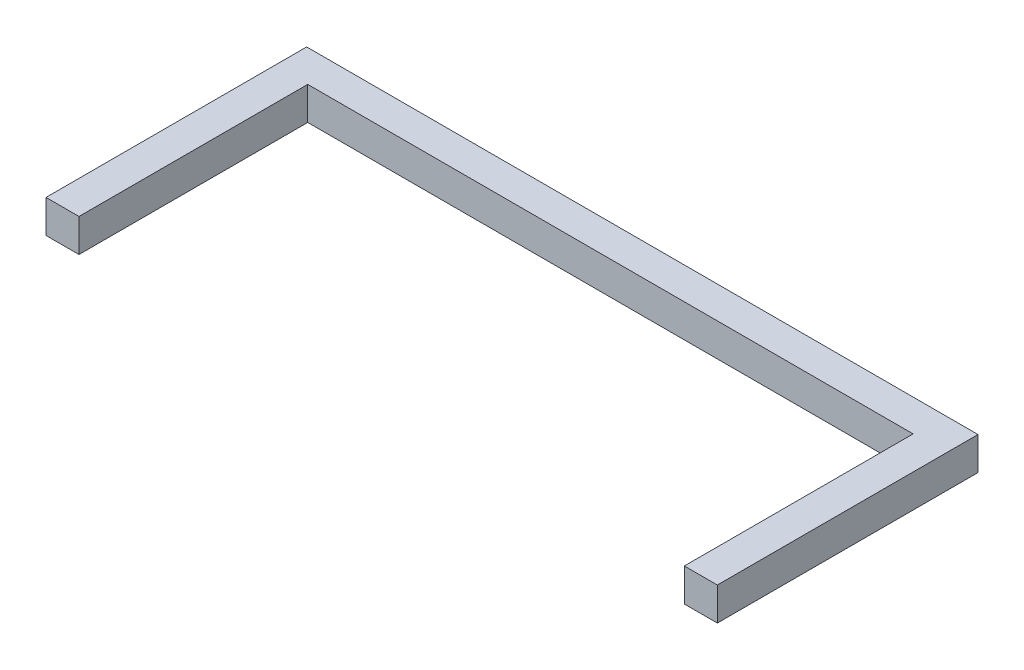
ISO-10303-21;
HEADER;
FILE_DESCRIPTION(('STEP AP214'),'2;1');
FILE_NAME('part.step','',(''),(''),'','','');
FILE_SCHEMA(('AUTOMOTIVE_DESIGN { 1 0 10303 214 1 1 1 1 }'));
ENDSEC;
DATA;
#1=APPLICATION_CONTEXT('core data for automotive mechanical design processes');
#2=APPLICATION_PROTOCOL_DEFINITION('international standard','automotive_design',2000,#1);
#3=PRODUCT_CONTEXT('',#1,'mechanical');
#4=PRODUCT('Part','Part','',(#3));
#5=PRODUCT_RELATED_PRODUCT_CATEGORY('part','',(#4));
#6=PRODUCT_DEFINITION_FORMATION('','',#4);
#7=PRODUCT_DEFINITION_CONTEXT('part definition',#1,'design');
#8=PRODUCT_DEFINITION('design','',#6,#7);
#9=PRODUCT_DEFINITION_SHAPE('','',#8);
#10=(LENGTH_UNIT() NAMED_UNIT(*) SI_UNIT(.MILLI.,.METRE.));
#11=(NAMED_UNIT(*) PLANE_ANGLE_UNIT() SI_UNIT($,.RADIAN.));
#12=(NAMED_UNIT(*) SI_UNIT($,.STERADIAN.) SOLID_ANGLE_UNIT());
#13=UNCERTAINTY_MEASURE_WITH_UNIT(LENGTH_MEASURE(1.E-05),#10,'distance_accuracy_value','');
#14=(GEOMETRIC_REPRESENTATION_CONTEXT(3) GLOBAL_UNCERTAINTY_ASSIGNED_CONTEXT((#13)) GLOBAL_UNIT_ASSIGNED_CONTEXT((#10,
#11,#12)) REPRESENTATION_CONTEXT('',''));
#15=CARTESIAN_POINT('',(0.,0.,0.));
#16=DIRECTION('',(0.,0.,1.));
#17=DIRECTION('',(1.,0.,0.));
#18=AXIS2_PLACEMENT_3D('',#15,#16,#17);
#19=CARTESIAN_POINT('',(3.1,3.1,0.));
#20=DIRECTION('',(0.,0.,-1.));
#21=DIRECTION('',(-1.,0.,0.));
#22=AXIS2_PLACEMENT_3D('',#19,#20,#21);
#23=PLANE('',#22);
#24=DIRECTION('',(1.,0.,0.));
#25=VECTOR('',#24,1.);
#26=CARTESIAN_POINT('',(3.1,0.,0.));
#27=LINE('',#26,#25);
#28=CARTESIAN_POINT('',(0.,0.,0.));
#29=VERTEX_POINT('',#28);
#30=CARTESIAN_POINT('',(3.1,0.,0.));
#31=VERTEX_POINT('',#30);
#32=EDGE_CURVE('E144',#29,#31,#27,.T.);
#33=ORIENTED_EDGE('',*,*,#32,.T.);
#34=DIRECTION('',(0.,-1.,0.));
#35=VECTOR('',#34,1.);
#36=CARTESIAN_POINT('',(3.1,3.1,0.));
#37=LINE('',#36,#35);
#38=CARTESIAN_POINT('',(3.1,3.1,0.));
#39=VERTEX_POINT('',#38);
#40=EDGE_CURVE('E11',#39,#31,#37,.T.);
#41=ORIENTED_EDGE('',*,*,#40,.F.);
#42=DIRECTION('',(1.,0.,0.));
#43=VECTOR('',#42,1.);
#44=CARTESIAN_POINT('',(3.1,3.1,0.));
#45=LINE('',#44,#43);
#46=CARTESIAN_POINT('',(0.,3.1,0.));
#47=VERTEX_POINT('',#46);
#48=EDGE_CURVE('E166',#47,#39,#45,.T.);
#49=ORIENTED_EDGE('',*,*,#48,.F.);
#50=DIRECTION('',(0.,-1.,0.));
#51=VECTOR('',#50,1.);
#52=CARTESIAN_POINT('',(0.,3.1,0.));
#53=LINE('',#52,#51);
#54=EDGE_CURVE('E140',#47,#29,#53,.T.);
#55=ORIENTED_EDGE('',*,*,#54,.T.);
#56=EDGE_LOOP('',(#33,#41,#49,#55));
#57=FACE_BOUND('',#56,.T.);
#58=ADVANCED_FACE('F43',(#57),#23,.F.);
#59=CARTESIAN_POINT('',(3.1,3.1,-21.5));
#60=DIRECTION('',(-1.,0.,0.));
#61=DIRECTION('',(0.,0.,1.));
#62=AXIS2_PLACEMENT_3D('',#59,#60,#61);
#63=PLANE('',#62);
#64=DIRECTION('',(0.,0.,-1.));
#65=VECTOR('',#64,1.);
#66=CARTESIAN_POINT('',(3.1,0.,-21.5));
#67=LINE('',#66,#65);
#68=CARTESIAN_POINT('',(3.1,0.,-21.5));
#69=VERTEX_POINT('',#68);
#70=EDGE_CURVE('E148',#31,#69,#67,.T.);
#71=ORIENTED_EDGE('',*,*,#70,.T.);
#72=DIRECTION('',(0.,-1.,0.));
#73=VECTOR('',#72,1.);
#74=CARTESIAN_POINT('',(3.1,3.1,-21.5));
#75=LINE('',#74,#73);
#76=CARTESIAN_POINT('',(3.1,3.1,-21.5));
#77=VERTEX_POINT('',#76);
#78=EDGE_CURVE('E52',#77,#69,#75,.T.);
#79=ORIENTED_EDGE('',*,*,#78,.F.);
#80=DIRECTION('',(0.,0.,-1.));
#81=VECTOR('',#80,1.);
#82=CARTESIAN_POINT('',(3.1,3.1,-21.5));
#83=LINE('',#82,#81);
#84=EDGE_CURVE('E103',#39,#77,#83,.T.);
#85=ORIENTED_EDGE('',*,*,#84,.F.);
#86=ORIENTED_EDGE('',*,*,#40,.T.);
#87=EDGE_LOOP('',(#71,#79,#85,#86));
#88=FACE_BOUND('',#87,.T.);
#89=ADVANCED_FACE('F212',(#88),#63,.F.);
#90=CARTESIAN_POINT('',(60.,3.1,-21.5));
#91=DIRECTION('',(0.,0.,-1.));
#92=DIRECTION('',(-1.,0.,0.));
#93=AXIS2_PLACEMENT_3D('',#90,#91,#92);
#94=PLANE('',#93);
#95=DIRECTION('',(1.,0.,0.));
#96=VECTOR('',#95,1.);
#97=CARTESIAN_POINT('',(60.,0.,-21.5));
#98=LINE('',#97,#96);
#99=CARTESIAN_POINT('',(60.,0.,-21.5));
#100=VERTEX_POINT('',#99);
#101=EDGE_CURVE('E151',#69,#100,#98,.T.);
#102=ORIENTED_EDGE('',*,*,#101,.T.);
#103=DIRECTION('',(0.,-1.,0.));
#104=VECTOR('',#103,1.);
#105=CARTESIAN_POINT('',(60.,3.1,-21.5));
#106=LINE('',#105,#104);
#107=CARTESIAN_POINT('',(60.,3.1,-21.5));
#108=VERTEX_POINT('',#107);
#109=EDGE_CURVE('E177',#108,#100,#106,.T.);
#110=ORIENTED_EDGE('',*,*,#109,.F.);
#111=DIRECTION('',(1.,0.,0.));
#112=VECTOR('',#111,1.);
#113=CARTESIAN_POINT('',(60.,3.1,-21.5));
#114=LINE('',#113,#112);
#115=EDGE_CURVE('E187',#77,#108,#114,.T.);
#116=ORIENTED_EDGE('',*,*,#115,.F.);
#117=ORIENTED_EDGE('',*,*,#78,.T.);
#118=EDGE_LOOP('',(#102,#110,#116,#117));
#119=FACE_BOUND('',#118,.T.);
#120=ADVANCED_FACE('F185',(#119),#94,.F.);
#121=CARTESIAN_POINT('',(60.,3.1,0.));
#122=DIRECTION('',(1.,0.,0.));
#123=DIRECTION('',(0.,0.,-1.));
#124=AXIS2_PLACEMENT_3D('',#121,#122,#123);
#125=PLANE('',#124);
#126=DIRECTION('',(0.,0.,1.));
#127=VECTOR('',#126,1.);
#128=CARTESIAN_POINT('',(60.,0.,0.));
#129=LINE('',#128,#127);
#130=CARTESIAN_POINT('',(60.,0.,0.));
#131=VERTEX_POINT('',#130);
#132=EDGE_CURVE('E154',#100,#131,#129,.T.);
#133=ORIENTED_EDGE('',*,*,#132,.T.);
#134=DIRECTION('',(0.,-1.,0.));
#135=VECTOR('',#134,1.);
#136=CARTESIAN_POINT('',(60.,3.1,0.));
#137=LINE('',#136,#135);
#138=CARTESIAN_POINT('',(60.,3.1,0.));
#139=VERTEX_POINT('',#138);
#140=EDGE_CURVE('E173',#139,#131,#137,.T.);
#141=ORIENTED_EDGE('',*,*,#140,.F.);
#142=DIRECTION('',(0.,0.,1.));
#143=VECTOR('',#142,1.);
#144=CARTESIAN_POINT('',(60.,3.1,0.));
#145=LINE('',#144,#143);
#146=EDGE_CURVE('E200',#108,#139,#145,.T.);
#147=ORIENTED_EDGE('',*,*,#146,.F.);
#148=ORIENTED_EDGE('',*,*,#109,.T.);
#149=EDGE_LOOP('',(#133,#141,#147,#148));
#150=FACE_BOUND('',#149,.T.);
#151=ADVANCED_FACE('F195',(#150),#125,.F.);
#152=CARTESIAN_POINT('',(63.1,3.1,0.));
#153=DIRECTION('',(0.,0.,-1.));
#154=DIRECTION('',(-1.,0.,0.));
#155=AXIS2_PLACEMENT_3D('',#152,#153,#154);
#156=PLANE('',#155);
#157=DIRECTION('',(1.,0.,0.));
#158=VECTOR('',#157,1.);
#159=CARTESIAN_POINT('',(63.1,0.,0.));
#160=LINE('',#159,#158);
#161=CARTESIAN_POINT('',(63.1,0.,0.));
#162=VERTEX_POINT('',#161);
#163=EDGE_CURVE('E157',#131,#162,#160,.T.);
#164=ORIENTED_EDGE('',*,*,#163,.T.);
#165=DIRECTION('',(0.,-1.,0.));
#166=VECTOR('',#165,1.);
#167=CARTESIAN_POINT('',(63.1,3.1,0.));
#168=LINE('',#167,#166);
#169=CARTESIAN_POINT('',(63.1,3.1,0.));
#170=VERTEX_POINT('',#169);
#171=EDGE_CURVE('E133',#170,#162,#168,.T.);
#172=ORIENTED_EDGE('',*,*,#171,.F.);
#173=DIRECTION('',(1.,0.,0.));
#174=VECTOR('',#173,1.);
#175=CARTESIAN_POINT('',(63.1,3.1,0.));
#176=LINE('',#175,#174);
#177=EDGE_CURVE('E122',#139,#170,#176,.T.);
#178=ORIENTED_EDGE('',*,*,#177,.F.);
#179=ORIENTED_EDGE('',*,*,#140,.T.);
#180=EDGE_LOOP('',(#164,#172,#178,#179));
#181=FACE_BOUND('',#180,.T.);
#182=ADVANCED_FACE('F198',(#181),#156,.F.);
#183=CARTESIAN_POINT('',(63.1,3.1,-24.5));
#184=DIRECTION('',(-1.,0.,0.));
#185=DIRECTION('',(0.,0.,1.));
#186=AXIS2_PLACEMENT_3D('',#183,#184,#185);
#187=PLANE('',#186);
#188=DIRECTION('',(0.,0.,-1.));
#189=VECTOR('',#188,1.);
#190=CARTESIAN_POINT('',(63.1,0.,-24.5));
#191=LINE('',#190,#189);
#192=CARTESIAN_POINT('',(63.1,0.,-24.5));
#193=VERTEX_POINT('',#192);
#194=EDGE_CURVE('E131',#162,#193,#191,.T.);
#195=ORIENTED_EDGE('',*,*,#194,.T.);
#196=DIRECTION('',(0.,-1.,0.));
#197=VECTOR('',#196,1.);
#198=CARTESIAN_POINT('',(63.1,3.1,-24.5));
#199=LINE('',#198,#197);
#200=CARTESIAN_POINT('',(63.1,3.1,-24.5));
#201=VERTEX_POINT('',#200);
#202=EDGE_CURVE('E128',#201,#193,#199,.T.);
#203=ORIENTED_EDGE('',*,*,#202,.F.);
#204=DIRECTION('',(0.,0.,-1.));
#205=VECTOR('',#204,1.);
#206=CARTESIAN_POINT('',(63.1,3.1,-24.5));
#207=LINE('',#206,#205);
#208=EDGE_CURVE('E116',#170,#201,#207,.T.);
#209=ORIENTED_EDGE('',*,*,#208,.F.);
#210=ORIENTED_EDGE('',*,*,#171,.T.);
#211=EDGE_LOOP('',(#195,#203,#209,#210));
#212=FACE_BOUND('',#211,.T.);
#213=ADVANCED_FACE('F129',(#212),#187,.F.);
#214=CARTESIAN_POINT('',(0.,3.1,-24.5));
#215=DIRECTION('',(0.,0.,1.));
#216=DIRECTION('',(1.,0.,0.));
#217=AXIS2_PLACEMENT_3D('',#214,#215,#216);
#218=PLANE('',#217);
#219=DIRECTION('',(-1.,0.,0.));
#220=VECTOR('',#219,1.);
#221=CARTESIAN_POINT('',(0.,0.,-24.5));
#222=LINE('',#221,#220);
#223=CARTESIAN_POINT('',(0.,0.,-24.5));
#224=VERTEX_POINT('',#223);
#225=EDGE_CURVE('E89',#193,#224,#222,.T.);
#226=ORIENTED_EDGE('',*,*,#225,.T.);
#227=DIRECTION('',(0.,-1.,0.));
#228=VECTOR('',#227,1.);
#229=CARTESIAN_POINT('',(0.,3.1,-24.5));
#230=LINE('',#229,#228);
#231=CARTESIAN_POINT('',(0.,3.1,-24.5));
#232=VERTEX_POINT('',#231);
#233=EDGE_CURVE('E134',#232,#224,#230,.T.);
#234=ORIENTED_EDGE('',*,*,#233,.F.);
#235=DIRECTION('',(-1.,0.,0.));
#236=VECTOR('',#235,1.);
#237=CARTESIAN_POINT('',(0.,3.1,-24.5));
#238=LINE('',#237,#236);
#239=EDGE_CURVE('E120',#201,#232,#238,.T.);
#240=ORIENTED_EDGE('',*,*,#239,.F.);
#241=ORIENTED_EDGE('',*,*,#202,.T.);
#242=EDGE_LOOP('',(#226,#234,#240,#241));
#243=FACE_BOUND('',#242,.T.);
#244=ADVANCED_FACE('F136',(#243),#218,.F.);
#245=CARTESIAN_POINT('',(0.,3.1,0.));
#246=DIRECTION('',(1.,0.,0.));
#247=DIRECTION('',(0.,0.,-1.));
#248=AXIS2_PLACEMENT_3D('',#245,#246,#247);
#249=PLANE('',#248);
#250=DIRECTION('',(0.,0.,1.));
#251=VECTOR('',#250,1.);
#252=CARTESIAN_POINT('',(0.,0.,0.));
#253=LINE('',#252,#251);
#254=EDGE_CURVE('E95',#224,#29,#253,.T.);
#255=ORIENTED_EDGE('',*,*,#254,.T.);
#256=ORIENTED_EDGE('',*,*,#54,.F.);
#257=DIRECTION('',(0.,0.,1.));
#258=VECTOR('',#257,1.);
#259=CARTESIAN_POINT('',(0.,3.1,0.));
#260=LINE('',#259,#258);
#261=EDGE_CURVE('E60',#232,#47,#260,.T.);
#262=ORIENTED_EDGE('',*,*,#261,.F.);
#263=ORIENTED_EDGE('',*,*,#233,.T.);
#264=EDGE_LOOP('',(#255,#256,#262,#263));
#265=FACE_BOUND('',#264,.T.);
#266=ADVANCED_FACE('F228',(#265),#249,.F.);
#267=CARTESIAN_POINT('',(0.,3.1,0.));
#268=DIRECTION('',(0.,-1.,0.));
#269=DIRECTION('',(0.,0.,-1.));
#270=AXIS2_PLACEMENT_3D('',#267,#268,#269);
#271=PLANE('',#270);
#272=ORIENTED_EDGE('',*,*,#48,.T.);
#273=ORIENTED_EDGE('',*,*,#84,.T.);
#274=ORIENTED_EDGE('',*,*,#115,.T.);
#275=ORIENTED_EDGE('',*,*,#146,.T.);
#276=ORIENTED_EDGE('',*,*,#177,.T.);
#277=ORIENTED_EDGE('',*,*,#208,.T.);
#278=ORIENTED_EDGE('',*,*,#239,.T.);
#279=ORIENTED_EDGE('',*,*,#261,.T.);
#280=EDGE_LOOP('',(#272,#273,#274,#275,#276,#277,#278,#279));
#281=FACE_BOUND('',#280,.T.);
#282=ADVANCED_FACE('F118',(#281),#271,.F.);
#283=CARTESIAN_POINT('',(0.,0.,0.));
#284=DIRECTION('',(0.,-1.,0.));
#285=DIRECTION('',(0.,0.,-1.));
#286=AXIS2_PLACEMENT_3D('',#283,#284,#285);
#287=PLANE('',#286);
#288=ORIENTED_EDGE('',*,*,#32,.F.);
#289=ORIENTED_EDGE('',*,*,#254,.F.);
#290=ORIENTED_EDGE('',*,*,#225,.F.);
#291=ORIENTED_EDGE('',*,*,#194,.F.);
#292=ORIENTED_EDGE('',*,*,#163,.F.);
#293=ORIENTED_EDGE('',*,*,#132,.F.);
#294=ORIENTED_EDGE('',*,*,#101,.F.);
#295=ORIENTED_EDGE('',*,*,#70,.F.);
#296=EDGE_LOOP('',(#288,#289,#290,#291,#292,#293,#294,#295));
#297=FACE_BOUND('',#296,.T.);
#298=ADVANCED_FACE('F191',(#297),#287,.T.);
#299=CLOSED_SHELL('',(#58,#89,#120,#151,#182,#213,#244,#266,#282,#298));
#300=MANIFOLD_SOLID_BREP('B2',#299);
#301=ADVANCED_BREP_SHAPE_REPRESENTATION('',(#18,#300),#14);
#302=SHAPE_DEFINITION_REPRESENTATION(#9,#301);
ENDSEC;
END-ISO-10303-21;
